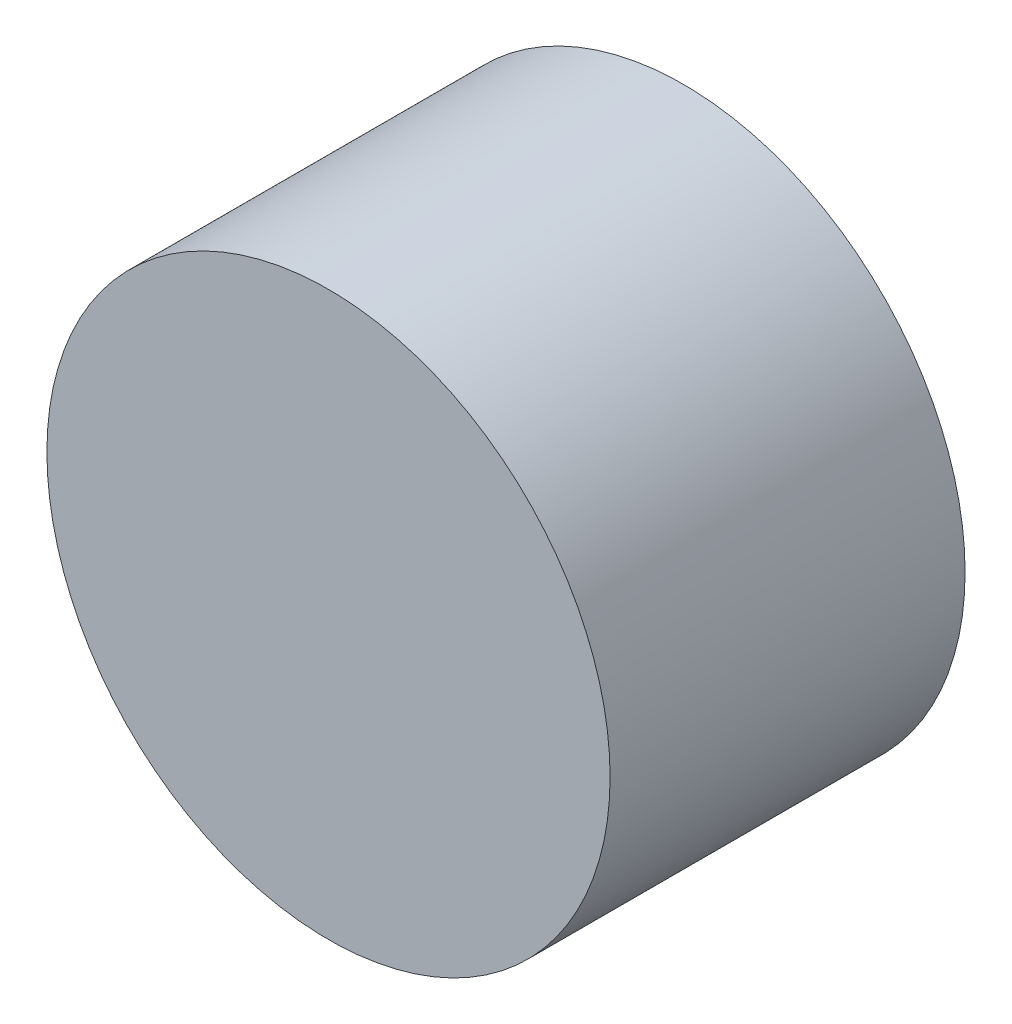
ISO-10303-21;
HEADER;
FILE_DESCRIPTION(('STEP AP214'),'2;1');
FILE_NAME('part.step','',(''),(''),'','','');
FILE_SCHEMA(('AUTOMOTIVE_DESIGN { 1 0 10303 214 1 1 1 1 }'));
ENDSEC;
DATA;
#1=APPLICATION_CONTEXT('core data for automotive mechanical design processes');
#2=APPLICATION_PROTOCOL_DEFINITION('international standard','automotive_design',2000,#1);
#3=PRODUCT_CONTEXT('',#1,'mechanical');
#4=PRODUCT('Part','Part','',(#3));
#5=PRODUCT_RELATED_PRODUCT_CATEGORY('part','',(#4));
#6=PRODUCT_DEFINITION_FORMATION('','',#4);
#7=PRODUCT_DEFINITION_CONTEXT('part definition',#1,'design');
#8=PRODUCT_DEFINITION('design','',#6,#7);
#9=PRODUCT_DEFINITION_SHAPE('','',#8);
#10=(LENGTH_UNIT() NAMED_UNIT(*) SI_UNIT(.MILLI.,.METRE.));
#11=(NAMED_UNIT(*) PLANE_ANGLE_UNIT() SI_UNIT($,.RADIAN.));
#12=(NAMED_UNIT(*) SI_UNIT($,.STERADIAN.) SOLID_ANGLE_UNIT());
#13=UNCERTAINTY_MEASURE_WITH_UNIT(LENGTH_MEASURE(1.E-05),#10,'distance_accuracy_value','');
#14=(GEOMETRIC_REPRESENTATION_CONTEXT(3) GLOBAL_UNCERTAINTY_ASSIGNED_CONTEXT((#13)) GLOBAL_UNIT_ASSIGNED_CONTEXT((#10,
#11,#12)) REPRESENTATION_CONTEXT('',''));
#15=CARTESIAN_POINT('',(0.,0.,0.));
#16=DIRECTION('',(0.,0.,1.));
#17=DIRECTION('',(1.,0.,0.));
#18=AXIS2_PLACEMENT_3D('',#15,#16,#17);
#19=CARTESIAN_POINT('',(0.,0.,30.));
#20=DIRECTION('',(0.,0.,-1.));
#21=DIRECTION('',(-1.,0.,0.));
#22=AXIS2_PLACEMENT_3D('',#19,#20,#21);
#23=CYLINDRICAL_SURFACE('',#22,23.7976062232234);
#24=CARTESIAN_POINT('',(0.,0.,30.));
#25=DIRECTION('',(0.,0.,1.));
#26=DIRECTION('',(1.,0.,0.));
#27=AXIS2_PLACEMENT_3D('',#24,#25,#26);
#28=CIRCLE('',#27,23.7976062232234);
#29=CARTESIAN_POINT('',(23.7976062232234,0.,30.));
#30=VERTEX_POINT('',#29);
#31=EDGE_CURVE('E10',#30,#30,#28,.T.);
#32=ORIENTED_EDGE('',*,*,#31,.F.);
#33=EDGE_LOOP('',(#32));
#34=FACE_BOUND('',#33,.T.);
#35=CARTESIAN_POINT('',(0.,0.,0.));
#36=DIRECTION('',(0.,0.,1.));
#37=DIRECTION('',(1.,0.,0.));
#38=AXIS2_PLACEMENT_3D('',#35,#36,#37);
#39=CIRCLE('',#38,23.7976062232234);
#40=CARTESIAN_POINT('',(23.7976062232234,0.,0.));
#41=VERTEX_POINT('',#40);
#42=EDGE_CURVE('E32',#41,#41,#39,.T.);
#43=ORIENTED_EDGE('',*,*,#42,.T.);
#44=EDGE_LOOP('',(#43));
#45=FACE_BOUND('',#44,.T.);
#46=ADVANCED_FACE('F29',(#34,#45),#23,.T.);
#47=CARTESIAN_POINT('',(0.,0.,30.));
#48=DIRECTION('',(0.,0.,1.));
#49=DIRECTION('',(1.,0.,0.));
#50=AXIS2_PLACEMENT_3D('',#47,#48,#49);
#51=PLANE('',#50);
#52=ORIENTED_EDGE('',*,*,#31,.T.);
#53=EDGE_LOOP('',(#52));
#54=FACE_BOUND('',#53,.T.);
#55=ADVANCED_FACE('F44',(#54),#51,.T.);
#56=CARTESIAN_POINT('',(0.,0.,0.));
#57=DIRECTION('',(0.,0.,1.));
#58=DIRECTION('',(1.,0.,0.));
#59=AXIS2_PLACEMENT_3D('',#56,#57,#58);
#60=PLANE('',#59);
#61=ORIENTED_EDGE('',*,*,#42,.F.);
#62=EDGE_LOOP('',(#61));
#63=FACE_BOUND('',#62,.T.);
#64=ADVANCED_FACE('F42',(#63),#60,.F.);
#65=CLOSED_SHELL('',(#46,#55,#64));
#66=MANIFOLD_SOLID_BREP('B2',#65);
#67=ADVANCED_BREP_SHAPE_REPRESENTATION('',(#18,#66),#14);
#68=SHAPE_DEFINITION_REPRESENTATION(#9,#67);
ENDSEC;
END-ISO-10303-21;
